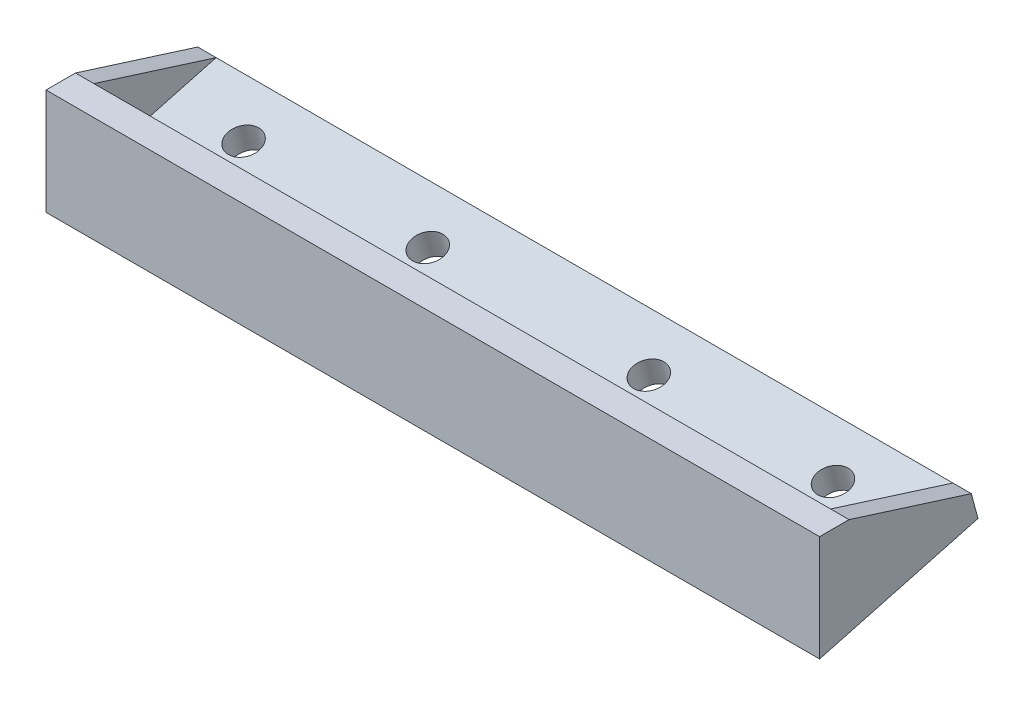
ISO-10303-21;
HEADER;
FILE_DESCRIPTION(('STEP AP214'),'2;1');
FILE_NAME('part.step','',(''),(''),'','','');
FILE_SCHEMA(('AUTOMOTIVE_DESIGN { 1 0 10303 214 1 1 1 1 }'));
ENDSEC;
DATA;
#1=APPLICATION_CONTEXT('core data for automotive mechanical design processes');
#2=APPLICATION_PROTOCOL_DEFINITION('international standard','automotive_design',2000,#1);
#3=PRODUCT_CONTEXT('',#1,'mechanical');
#4=PRODUCT('Part','Part','',(#3));
#5=PRODUCT_RELATED_PRODUCT_CATEGORY('part','',(#4));
#6=PRODUCT_DEFINITION_FORMATION('','',#4);
#7=PRODUCT_DEFINITION_CONTEXT('part definition',#1,'design');
#8=PRODUCT_DEFINITION('design','',#6,#7);
#9=PRODUCT_DEFINITION_SHAPE('','',#8);
#10=(LENGTH_UNIT() NAMED_UNIT(*) SI_UNIT(.MILLI.,.METRE.));
#11=(NAMED_UNIT(*) PLANE_ANGLE_UNIT() SI_UNIT($,.RADIAN.));
#12=(NAMED_UNIT(*) SI_UNIT($,.STERADIAN.) SOLID_ANGLE_UNIT());
#13=UNCERTAINTY_MEASURE_WITH_UNIT(LENGTH_MEASURE(1.E-05),#10,'distance_accuracy_value','');
#14=(GEOMETRIC_REPRESENTATION_CONTEXT(3) GLOBAL_UNCERTAINTY_ASSIGNED_CONTEXT((#13)) GLOBAL_UNIT_ASSIGNED_CONTEXT((#10,
#11,#12)) REPRESENTATION_CONTEXT('',''));
#15=CARTESIAN_POINT('',(0.,0.,0.));
#16=DIRECTION('',(0.,0.,1.));
#17=DIRECTION('',(1.,0.,0.));
#18=AXIS2_PLACEMENT_3D('',#15,#16,#17);
#19=CARTESIAN_POINT('',(158.,10.6217782649107,-60.));
#20=DIRECTION('',(0.,0.,1.));
#21=DIRECTION('',(1.,0.,0.));
#22=AXIS2_PLACEMENT_3D('',#19,#20,#21);
#23=PLANE('',#22);
#24=DIRECTION('',(0.,-1.,0.));
#25=VECTOR('',#24,1.);
#26=CARTESIAN_POINT('',(153.,30.,-60.));
#27=LINE('',#26,#25);
#28=CARTESIAN_POINT('',(153.,30.,-60.));
#29=VERTEX_POINT('',#28);
#30=CARTESIAN_POINT('',(153.,17.1379051291167,-60.));
#31=VERTEX_POINT('',#30);
#32=EDGE_CURVE('E68',#29,#31,#27,.T.);
#33=ORIENTED_EDGE('',*,*,#32,.T.);
#34=DIRECTION('',(-1.,0.,0.));
#35=VECTOR('',#34,1.);
#36=CARTESIAN_POINT('',(-52.,17.1379051291167,-60.));
#37=LINE('',#36,#35);
#38=CARTESIAN_POINT('',(-47.,17.1379051291167,-60.));
#39=VERTEX_POINT('',#38);
#40=EDGE_CURVE('E53',#31,#39,#37,.T.);
#41=ORIENTED_EDGE('',*,*,#40,.T.);
#42=DIRECTION('',(0.,1.,0.));
#43=VECTOR('',#42,1.);
#44=CARTESIAN_POINT('',(-47.,30.,-60.));
#45=LINE('',#44,#43);
#46=CARTESIAN_POINT('',(-47.,30.,-60.));
#47=VERTEX_POINT('',#46);
#48=EDGE_CURVE('E193',#39,#47,#45,.T.);
#49=ORIENTED_EDGE('',*,*,#48,.T.);
#50=DIRECTION('',(-1.,0.,0.));
#51=VECTOR('',#50,1.);
#52=CARTESIAN_POINT('',(158.,30.,-60.));
#53=LINE('',#52,#51);
#54=EDGE_CURVE('E230',#29,#47,#53,.T.);
#55=ORIENTED_EDGE('',*,*,#54,.F.);
#56=EDGE_LOOP('',(#33,#41,#49,#55));
#57=FACE_BOUND('',#56,.T.);
#58=ADVANCED_FACE('F43',(#57),#23,.F.);
#59=CARTESIAN_POINT('',(158.,20.,-95.));
#60=DIRECTION('',(0.,-0.965925826289068,-0.258819045102521));
#61=DIRECTION('',(0.,0.258819045102521,-0.965925826289068));
#62=AXIS2_PLACEMENT_3D('',#59,#60,#61);
#63=PLANE('',#62);
#64=CARTESIAN_POINT('',(-27.,16.1498999348201,-80.6312309425245));
#65=DIRECTION('',(0.,0.965925826289068,0.258819045102521));
#66=DIRECTION('',(0.,-0.258819045102521,0.965925826289068));
#67=AXIS2_PLACEMENT_3D('',#64,#65,#66);
#68=CIRCLE('',#67,4.25000000000001);
#69=CARTESIAN_POINT('',(-27.,15.0499189931344,-76.5260461807959));
#70=VERTEX_POINT('',#69);
#71=EDGE_CURVE('E162',#70,#70,#68,.T.);
#72=ORIENTED_EDGE('',*,*,#71,.F.);
#73=EDGE_LOOP('',(#72));
#74=FACE_BOUND('',#73,.T.);
#75=CARTESIAN_POINT('',(23.,16.1498999348201,-80.6312309425245));
#76=DIRECTION('',(0.,0.965925826289068,0.258819045102521));
#77=DIRECTION('',(0.,-0.258819045102521,0.965925826289068));
#78=AXIS2_PLACEMENT_3D('',#75,#76,#77);
#79=CIRCLE('',#78,4.25000000000001);
#80=CARTESIAN_POINT('',(23.,15.0499189931344,-76.5260461807959));
#81=VERTEX_POINT('',#80);
#82=EDGE_CURVE('E263',#81,#81,#79,.T.);
#83=ORIENTED_EDGE('',*,*,#82,.F.);
#84=EDGE_LOOP('',(#83));
#85=FACE_BOUND('',#84,.T.);
#86=CARTESIAN_POINT('',(83.,16.1498999348201,-80.6312309425245));
#87=DIRECTION('',(0.,0.965925826289068,0.258819045102521));
#88=DIRECTION('',(0.,-0.258819045102521,0.965925826289068));
#89=AXIS2_PLACEMENT_3D('',#86,#87,#88);
#90=CIRCLE('',#89,4.25000000000001);
#91=CARTESIAN_POINT('',(83.,15.0499189931344,-76.5260461807959));
#92=VERTEX_POINT('',#91);
#93=EDGE_CURVE('E259',#92,#92,#90,.T.);
#94=ORIENTED_EDGE('',*,*,#93,.F.);
#95=EDGE_LOOP('',(#94));
#96=FACE_BOUND('',#95,.T.);
#97=CARTESIAN_POINT('',(133.,16.1498999348201,-80.6312309425245));
#98=DIRECTION('',(0.,0.965925826289068,0.258819045102521));
#99=DIRECTION('',(0.,-0.258819045102521,0.965925826289068));
#100=AXIS2_PLACEMENT_3D('',#97,#98,#99);
#101=CIRCLE('',#100,4.25000000000001);
#102=CARTESIAN_POINT('',(133.,15.0499189931344,-76.5260461807959));
#103=VERTEX_POINT('',#102);
#104=EDGE_CURVE('E139',#103,#103,#101,.T.);
#105=ORIENTED_EDGE('',*,*,#104,.F.);
#106=EDGE_LOOP('',(#105));
#107=FACE_BOUND('',#106,.T.);
#108=DIRECTION('',(0.,0.258819045102521,-0.965925826289068));
#109=VECTOR('',#108,1.);
#110=CARTESIAN_POINT('',(153.,12.3082759976714,-66.2940952255126));
#111=LINE('',#110,#109);
#112=CARTESIAN_POINT('',(153.,12.3082759976714,-66.2940952255126));
#113=VERTEX_POINT('',#112);
#114=CARTESIAN_POINT('',(153.,19.5145475211529,-93.1882666842824));
#115=VERTEX_POINT('',#114);
#116=EDGE_CURVE('E180',#113,#115,#111,.T.);
#117=ORIENTED_EDGE('',*,*,#116,.T.);
#118=DIRECTION('',(-1.,0.,0.));
#119=VECTOR('',#118,1.);
#120=CARTESIAN_POINT('',(158.,19.5145475211529,-93.1882666842824));
#121=LINE('',#120,#119);
#122=CARTESIAN_POINT('',(-47.,19.5145475211529,-93.1882666842824));
#123=VERTEX_POINT('',#122);
#124=EDGE_CURVE('E213',#115,#123,#121,.T.);
#125=ORIENTED_EDGE('',*,*,#124,.T.);
#126=DIRECTION('',(0.,-0.258819045102521,0.965925826289068));
#127=VECTOR('',#126,1.);
#128=CARTESIAN_POINT('',(-47.,12.3082759976714,-66.2940952255126));
#129=LINE('',#128,#127);
#130=CARTESIAN_POINT('',(-47.,12.3082759976714,-66.2940952255126));
#131=VERTEX_POINT('',#130);
#132=EDGE_CURVE('E185',#123,#131,#129,.T.);
#133=ORIENTED_EDGE('',*,*,#132,.T.);
#134=DIRECTION('',(-1.,0.,0.));
#135=VECTOR('',#134,1.);
#136=CARTESIAN_POINT('',(158.,12.3082759976714,-66.2940952255126));
#137=LINE('',#136,#135);
#138=EDGE_CURVE('E11',#131,#113,#137,.F.);
#139=ORIENTED_EDGE('',*,*,#138,.T.);
#140=EDGE_LOOP('',(#117,#125,#133,#139));
#141=FACE_BOUND('',#140,.T.);
#142=ADVANCED_FACE('F245',(#74,#85,#96,#107,#141),#63,.F.);
#143=CARTESIAN_POINT('',(158.,17.1379051291167,-65.));
#144=DIRECTION('',(1.,0.,0.));
#145=DIRECTION('',(0.,0.,-1.));
#146=AXIS2_PLACEMENT_3D('',#143,#144,#145);
#147=CYLINDRICAL_SURFACE('',#146,5.);
#148=CARTESIAN_POINT('',(153.,17.1379051291167,-65.));
#149=DIRECTION('',(1.,0.,0.));
#150=DIRECTION('',(0.,0.,-1.));
#151=AXIS2_PLACEMENT_3D('',#148,#149,#150);
#152=CIRCLE('',#151,5.);
#153=EDGE_CURVE('E61',#31,#113,#152,.T.);
#154=ORIENTED_EDGE('',*,*,#153,.T.);
#155=ORIENTED_EDGE('',*,*,#138,.F.);
#156=CARTESIAN_POINT('',(-47.,17.1379051291167,-65.));
#157=DIRECTION('',(-1.,0.,0.));
#158=DIRECTION('',(0.,0.,1.));
#159=AXIS2_PLACEMENT_3D('',#156,#157,#158);
#160=CIRCLE('',#159,5.);
#161=EDGE_CURVE('E188',#131,#39,#160,.T.);
#162=ORIENTED_EDGE('',*,*,#161,.T.);
#163=ORIENTED_EDGE('',*,*,#40,.F.);
#164=EDGE_LOOP('',(#154,#155,#162,#163));
#165=FACE_BOUND('',#164,.T.);
#166=ADVANCED_FACE('F45',(#165),#147,.F.);
#167=CARTESIAN_POINT('',(160.,30.,-31.93));
#168=DIRECTION('',(0.,1.,0.));
#169=DIRECTION('',(0.,0.,1.));
#170=AXIS2_PLACEMENT_3D('',#167,#168,#169);
#171=PLANE('',#170);
#172=DIRECTION('',(-1.,0.,0.));
#173=VECTOR('',#172,1.);
#174=CARTESIAN_POINT('',(160.,30.,-52.));
#175=LINE('',#174,#173);
#176=CARTESIAN_POINT('',(158.,30.,-52.));
#177=VERTEX_POINT('',#176);
#178=CARTESIAN_POINT('',(-52.,30.,-52.));
#179=VERTEX_POINT('',#178);
#180=EDGE_CURVE('E120',#177,#179,#175,.T.);
#181=ORIENTED_EDGE('',*,*,#180,.F.);
#182=DIRECTION('',(0.,0.,1.));
#183=VECTOR('',#182,1.);
#184=CARTESIAN_POINT('',(158.,30.,0.));
#185=LINE('',#184,#183);
#186=CARTESIAN_POINT('',(158.,30.,-60.));
#187=VERTEX_POINT('',#186);
#188=EDGE_CURVE('E135',#187,#177,#185,.T.);
#189=ORIENTED_EDGE('',*,*,#188,.F.);
#190=EDGE_CURVE('E153',#187,#29,#53,.T.);
#191=ORIENTED_EDGE('',*,*,#190,.T.);
#192=ORIENTED_EDGE('',*,*,#54,.T.);
#193=DIRECTION('',(-1.,0.,0.));
#194=VECTOR('',#193,1.);
#195=CARTESIAN_POINT('',(-47.,30.,-60.));
#196=LINE('',#195,#194);
#197=CARTESIAN_POINT('',(-52.,30.,-60.));
#198=VERTEX_POINT('',#197);
#199=EDGE_CURVE('E200',#47,#198,#196,.T.);
#200=ORIENTED_EDGE('',*,*,#199,.T.);
#201=DIRECTION('',(0.,0.,1.));
#202=VECTOR('',#201,1.);
#203=CARTESIAN_POINT('',(-52.,30.,0.));
#204=LINE('',#203,#202);
#205=EDGE_CURVE('E138',#198,#179,#204,.T.);
#206=ORIENTED_EDGE('',*,*,#205,.T.);
#207=EDGE_LOOP('',(#181,#189,#191,#192,#200,#206));
#208=FACE_BOUND('',#207,.T.);
#209=ADVANCED_FACE('F133',(#208),#171,.T.);
#210=CARTESIAN_POINT('',(158.,0.,0.));
#211=DIRECTION('',(-1.,0.,0.));
#212=DIRECTION('',(0.,0.,1.));
#213=AXIS2_PLACEMENT_3D('',#210,#211,#212);
#214=PLANE('',#213);
#215=ORIENTED_EDGE('',*,*,#188,.T.);
#216=DIRECTION('',(0.,-1.,0.));
#217=VECTOR('',#216,1.);
#218=CARTESIAN_POINT('',(158.,17.3,-52.));
#219=LINE('',#218,#217);
#220=CARTESIAN_POINT('',(158.,1.2312514625911,-52.));
#221=VERTEX_POINT('',#220);
#222=EDGE_CURVE('E117',#177,#221,#219,.T.);
#223=ORIENTED_EDGE('',*,*,#222,.T.);
#224=DIRECTION('',(0.,0.258819045102521,-0.965925826289068));
#225=VECTOR('',#224,1.);
#226=CARTESIAN_POINT('',(158.,12.7530667371294,-95.));
#227=LINE('',#226,#225);
#228=CARTESIAN_POINT('',(158.,12.7530667371294,-95.));
#229=VERTEX_POINT('',#228);
#230=EDGE_CURVE('E222',#221,#229,#227,.T.);
#231=ORIENTED_EDGE('',*,*,#230,.T.);
#232=DIRECTION('',(0.,0.965925826289068,0.25881904510252));
#233=VECTOR('',#232,1.);
#234=CARTESIAN_POINT('',(158.,12.7530667371294,-95.));
#235=LINE('',#234,#233);
#236=CARTESIAN_POINT('',(158.,19.5145475211529,-93.1882666842824));
#237=VERTEX_POINT('',#236);
#238=EDGE_CURVE('E211',#229,#237,#235,.T.);
#239=ORIENTED_EDGE('',*,*,#238,.T.);
#240=DIRECTION('',(0.,0.301260615671901,0.95354184042704));
#241=VECTOR('',#240,1.);
#242=CARTESIAN_POINT('',(158.,19.5145475211529,-93.1882666842824));
#243=LINE('',#242,#241);
#244=EDGE_CURVE('E145',#237,#187,#243,.T.);
#245=ORIENTED_EDGE('',*,*,#244,.T.);
#246=EDGE_LOOP('',(#215,#223,#231,#239,#245));
#247=FACE_BOUND('',#246,.T.);
#248=ADVANCED_FACE('F142',(#247),#214,.F.);
#249=CARTESIAN_POINT('',(-52.,0.,0.));
#250=DIRECTION('',(-1.,0.,0.));
#251=DIRECTION('',(0.,0.,1.));
#252=AXIS2_PLACEMENT_3D('',#249,#250,#251);
#253=PLANE('',#252);
#254=DIRECTION('',(0.,-1.,0.));
#255=VECTOR('',#254,1.);
#256=CARTESIAN_POINT('',(-52.,17.3,-52.));
#257=LINE('',#256,#255);
#258=CARTESIAN_POINT('',(-52.,1.2312514625911,-52.));
#259=VERTEX_POINT('',#258);
#260=EDGE_CURVE('E130',#179,#259,#257,.T.);
#261=ORIENTED_EDGE('',*,*,#260,.F.);
#262=ORIENTED_EDGE('',*,*,#205,.F.);
#263=DIRECTION('',(0.,-0.301260615671901,-0.95354184042704));
#264=VECTOR('',#263,1.);
#265=CARTESIAN_POINT('',(-52.,19.5145475211529,-93.1882666842824));
#266=LINE('',#265,#264);
#267=CARTESIAN_POINT('',(-52.,19.5145475211529,-93.1882666842824));
#268=VERTEX_POINT('',#267);
#269=EDGE_CURVE('E189',#198,#268,#266,.T.);
#270=ORIENTED_EDGE('',*,*,#269,.T.);
#271=DIRECTION('',(0.,0.965925826289068,0.25881904510252));
#272=VECTOR('',#271,1.);
#273=CARTESIAN_POINT('',(-52.,12.7530667371294,-95.));
#274=LINE('',#273,#272);
#275=CARTESIAN_POINT('',(-52.,12.7530667371294,-95.));
#276=VERTEX_POINT('',#275);
#277=EDGE_CURVE('E208',#276,#268,#274,.T.);
#278=ORIENTED_EDGE('',*,*,#277,.F.);
#279=DIRECTION('',(0.,0.258819045102521,-0.965925826289068));
#280=VECTOR('',#279,1.);
#281=CARTESIAN_POINT('',(-52.,12.7530667371294,-95.));
#282=LINE('',#281,#280);
#283=EDGE_CURVE('E129',#259,#276,#282,.T.);
#284=ORIENTED_EDGE('',*,*,#283,.F.);
#285=EDGE_LOOP('',(#261,#262,#270,#278,#284));
#286=FACE_BOUND('',#285,.T.);
#287=ADVANCED_FACE('F293',(#286),#253,.T.);
#288=CARTESIAN_POINT('',(158.,12.7530667371294,-95.));
#289=DIRECTION('',(0.,0.965925826289068,0.258819045102521));
#290=DIRECTION('',(0.,-0.258819045102521,0.965925826289068));
#291=AXIS2_PLACEMENT_3D('',#288,#289,#290);
#292=PLANE('',#291);
#293=CARTESIAN_POINT('',(-27.,9.38841915079663,-82.4429642582421));
#294=DIRECTION('',(0.,0.965925826289068,0.258819045102521));
#295=DIRECTION('',(0.,-0.258819045102521,0.965925826289068));
#296=AXIS2_PLACEMENT_3D('',#293,#294,#295);
#297=CIRCLE('',#296,4.25000000000001);
#298=CARTESIAN_POINT('',(-27.,8.28843820911091,-78.3377794965136));
#299=VERTEX_POINT('',#298);
#300=EDGE_CURVE('E47',#299,#299,#297,.T.);
#301=ORIENTED_EDGE('',*,*,#300,.T.);
#302=EDGE_LOOP('',(#301));
#303=FACE_BOUND('',#302,.T.);
#304=CARTESIAN_POINT('',(23.,9.38841915079663,-82.4429642582421));
#305=DIRECTION('',(0.,0.965925826289068,0.258819045102521));
#306=DIRECTION('',(0.,-0.258819045102521,0.965925826289068));
#307=AXIS2_PLACEMENT_3D('',#304,#305,#306);
#308=CIRCLE('',#307,4.25000000000001);
#309=CARTESIAN_POINT('',(23.,8.28843820911091,-78.3377794965136));
#310=VERTEX_POINT('',#309);
#311=EDGE_CURVE('E165',#310,#310,#308,.T.);
#312=ORIENTED_EDGE('',*,*,#311,.T.);
#313=EDGE_LOOP('',(#312));
#314=FACE_BOUND('',#313,.T.);
#315=CARTESIAN_POINT('',(83.,9.38841915079663,-82.4429642582421));
#316=DIRECTION('',(0.,0.965925826289068,0.258819045102521));
#317=DIRECTION('',(0.,-0.258819045102521,0.965925826289068));
#318=AXIS2_PLACEMENT_3D('',#315,#316,#317);
#319=CIRCLE('',#318,4.25000000000001);
#320=CARTESIAN_POINT('',(83.,8.28843820911091,-78.3377794965136));
#321=VERTEX_POINT('',#320);
#322=EDGE_CURVE('E161',#321,#321,#319,.T.);
#323=ORIENTED_EDGE('',*,*,#322,.T.);
#324=EDGE_LOOP('',(#323));
#325=FACE_BOUND('',#324,.T.);
#326=CARTESIAN_POINT('',(133.,9.38841915079663,-82.4429642582421));
#327=DIRECTION('',(0.,0.965925826289068,0.258819045102521));
#328=DIRECTION('',(0.,-0.258819045102521,0.965925826289068));
#329=AXIS2_PLACEMENT_3D('',#326,#327,#328);
#330=CIRCLE('',#329,4.25000000000001);
#331=CARTESIAN_POINT('',(133.,8.28843820911091,-78.3377794965136));
#332=VERTEX_POINT('',#331);
#333=EDGE_CURVE('E157',#332,#332,#330,.T.);
#334=ORIENTED_EDGE('',*,*,#333,.T.);
#335=EDGE_LOOP('',(#334));
#336=FACE_BOUND('',#335,.T.);
#337=ORIENTED_EDGE('',*,*,#283,.T.);
#338=DIRECTION('',(-1.,0.,0.));
#339=VECTOR('',#338,1.);
#340=CARTESIAN_POINT('',(158.,12.7530667371294,-95.));
#341=LINE('',#340,#339);
#342=EDGE_CURVE('E228',#229,#276,#341,.T.);
#343=ORIENTED_EDGE('',*,*,#342,.F.);
#344=ORIENTED_EDGE('',*,*,#230,.F.);
#345=DIRECTION('',(-1.,0.,0.));
#346=VECTOR('',#345,1.);
#347=CARTESIAN_POINT('',(158.,1.2312514625911,-52.));
#348=LINE('',#347,#346);
#349=EDGE_CURVE('E123',#221,#259,#348,.T.);
#350=ORIENTED_EDGE('',*,*,#349,.T.);
#351=EDGE_LOOP('',(#337,#343,#344,#350));
#352=FACE_BOUND('',#351,.T.);
#353=ADVANCED_FACE('F290',(#303,#314,#325,#336,#352),#292,.F.);
#354=CARTESIAN_POINT('',(158.,17.3,-52.));
#355=DIRECTION('',(0.,0.,-1.));
#356=DIRECTION('',(-1.,0.,0.));
#357=AXIS2_PLACEMENT_3D('',#354,#355,#356);
#358=PLANE('',#357);
#359=ORIENTED_EDGE('',*,*,#222,.F.);
#360=ORIENTED_EDGE('',*,*,#180,.T.);
#361=ORIENTED_EDGE('',*,*,#260,.T.);
#362=ORIENTED_EDGE('',*,*,#349,.F.);
#363=EDGE_LOOP('',(#359,#360,#361,#362));
#364=FACE_BOUND('',#363,.T.);
#365=ADVANCED_FACE('F119',(#364),#358,.F.);
#366=CARTESIAN_POINT('',(158.,12.7530667371294,-95.));
#367=DIRECTION('',(0.,-0.25881904510252,0.965925826289068));
#368=DIRECTION('',(0.,-0.965925826289068,-0.25881904510252));
#369=AXIS2_PLACEMENT_3D('',#366,#367,#368);
#370=PLANE('',#369);
#371=ORIENTED_EDGE('',*,*,#277,.T.);
#372=DIRECTION('',(-1.,0.,0.));
#373=VECTOR('',#372,1.);
#374=CARTESIAN_POINT('',(-47.,19.5145475211529,-93.1882666842824));
#375=LINE('',#374,#373);
#376=EDGE_CURVE('E204',#123,#268,#375,.T.);
#377=ORIENTED_EDGE('',*,*,#376,.F.);
#378=ORIENTED_EDGE('',*,*,#124,.F.);
#379=EDGE_CURVE('E216',#237,#115,#121,.T.);
#380=ORIENTED_EDGE('',*,*,#379,.F.);
#381=ORIENTED_EDGE('',*,*,#238,.F.);
#382=ORIENTED_EDGE('',*,*,#342,.T.);
#383=EDGE_LOOP('',(#371,#377,#378,#380,#381,#382));
#384=FACE_BOUND('',#383,.T.);
#385=ADVANCED_FACE('F300',(#384),#370,.F.);
#386=CARTESIAN_POINT('',(-47.,19.5145475211529,-93.1882666842824));
#387=DIRECTION('',(0.,0.95354184042704,-0.301260615671901));
#388=DIRECTION('',(0.,0.301260615671901,0.95354184042704));
#389=AXIS2_PLACEMENT_3D('',#386,#387,#388);
#390=PLANE('',#389);
#391=ORIENTED_EDGE('',*,*,#269,.F.);
#392=ORIENTED_EDGE('',*,*,#199,.F.);
#393=DIRECTION('',(0.,-0.301260615671901,-0.95354184042704));
#394=VECTOR('',#393,1.);
#395=CARTESIAN_POINT('',(-47.,19.5145475211529,-93.1882666842824));
#396=LINE('',#395,#394);
#397=EDGE_CURVE('E196',#47,#123,#396,.T.);
#398=ORIENTED_EDGE('',*,*,#397,.T.);
#399=ORIENTED_EDGE('',*,*,#376,.T.);
#400=EDGE_LOOP('',(#391,#392,#398,#399));
#401=FACE_BOUND('',#400,.T.);
#402=ADVANCED_FACE('F240',(#401),#390,.T.);
#403=CARTESIAN_POINT('',(-47.,17.1379051291167,-65.));
#404=DIRECTION('',(-1.,0.,0.));
#405=DIRECTION('',(0.,0.,1.));
#406=AXIS2_PLACEMENT_3D('',#403,#404,#405);
#407=PLANE('',#406);
#408=ORIENTED_EDGE('',*,*,#132,.F.);
#409=ORIENTED_EDGE('',*,*,#397,.F.);
#410=ORIENTED_EDGE('',*,*,#48,.F.);
#411=ORIENTED_EDGE('',*,*,#161,.F.);
#412=EDGE_LOOP('',(#408,#409,#410,#411));
#413=FACE_BOUND('',#412,.T.);
#414=ADVANCED_FACE('F242',(#413),#407,.F.);
#415=CARTESIAN_POINT('',(153.,19.5145475211529,-93.1882666842824));
#416=DIRECTION('',(0.,0.95354184042704,-0.301260615671901));
#417=DIRECTION('',(0.,0.301260615671901,0.95354184042704));
#418=AXIS2_PLACEMENT_3D('',#415,#416,#417);
#419=PLANE('',#418);
#420=ORIENTED_EDGE('',*,*,#244,.F.);
#421=ORIENTED_EDGE('',*,*,#379,.T.);
#422=DIRECTION('',(0.,0.301260615671901,0.95354184042704));
#423=VECTOR('',#422,1.);
#424=CARTESIAN_POINT('',(153.,19.5145475211529,-93.1882666842824));
#425=LINE('',#424,#423);
#426=EDGE_CURVE('E251',#115,#29,#425,.T.);
#427=ORIENTED_EDGE('',*,*,#426,.T.);
#428=ORIENTED_EDGE('',*,*,#190,.F.);
#429=EDGE_LOOP('',(#420,#421,#427,#428));
#430=FACE_BOUND('',#429,.T.);
#431=ADVANCED_FACE('F302',(#430),#419,.T.);
#432=CARTESIAN_POINT('',(153.,17.1379051291167,-65.));
#433=DIRECTION('',(1.,0.,0.));
#434=DIRECTION('',(0.,0.,-1.));
#435=AXIS2_PLACEMENT_3D('',#432,#433,#434);
#436=PLANE('',#435);
#437=ORIENTED_EDGE('',*,*,#153,.F.);
#438=ORIENTED_EDGE('',*,*,#32,.F.);
#439=ORIENTED_EDGE('',*,*,#426,.F.);
#440=ORIENTED_EDGE('',*,*,#116,.F.);
#441=EDGE_LOOP('',(#437,#438,#439,#440));
#442=FACE_BOUND('',#441,.T.);
#443=ADVANCED_FACE('F249',(#442),#436,.F.);
#444=CARTESIAN_POINT('',(133.,-2.51035410302427,-85.6312309425245));
#445=DIRECTION('',(0.,0.965925826289068,0.258819045102521));
#446=DIRECTION('',(0.,-0.258819045102521,0.965925826289068));
#447=AXIS2_PLACEMENT_3D('',#444,#445,#446);
#448=CYLINDRICAL_SURFACE('',#447,4.25000000000001);
#449=ORIENTED_EDGE('',*,*,#104,.T.);
#450=EDGE_LOOP('',(#449));
#451=FACE_BOUND('',#450,.T.);
#452=ORIENTED_EDGE('',*,*,#333,.F.);
#453=EDGE_LOOP('',(#452));
#454=FACE_BOUND('',#453,.T.);
#455=ADVANCED_FACE('F283',(#451,#454),#448,.F.);
#456=CARTESIAN_POINT('',(83.,-2.51035410302427,-85.6312309425245));
#457=DIRECTION('',(0.,0.965925826289068,0.258819045102521));
#458=DIRECTION('',(0.,-0.258819045102521,0.965925826289068));
#459=AXIS2_PLACEMENT_3D('',#456,#457,#458);
#460=CYLINDRICAL_SURFACE('',#459,4.25000000000001);
#461=ORIENTED_EDGE('',*,*,#93,.T.);
#462=EDGE_LOOP('',(#461));
#463=FACE_BOUND('',#462,.T.);
#464=ORIENTED_EDGE('',*,*,#322,.F.);
#465=EDGE_LOOP('',(#464));
#466=FACE_BOUND('',#465,.T.);
#467=ADVANCED_FACE('F286',(#463,#466),#460,.F.);
#468=CARTESIAN_POINT('',(23.,-2.51035410302427,-85.6312309425245));
#469=DIRECTION('',(0.,0.965925826289068,0.258819045102521));
#470=DIRECTION('',(0.,-0.258819045102521,0.965925826289068));
#471=AXIS2_PLACEMENT_3D('',#468,#469,#470);
#472=CYLINDRICAL_SURFACE('',#471,4.25000000000001);
#473=ORIENTED_EDGE('',*,*,#82,.T.);
#474=EDGE_LOOP('',(#473));
#475=FACE_BOUND('',#474,.T.);
#476=ORIENTED_EDGE('',*,*,#311,.F.);
#477=EDGE_LOOP('',(#476));
#478=FACE_BOUND('',#477,.T.);
#479=ADVANCED_FACE('F381',(#475,#478),#472,.F.);
#480=CARTESIAN_POINT('',(-27.,-2.51035410302427,-85.6312309425245));
#481=DIRECTION('',(0.,0.965925826289068,0.258819045102521));
#482=DIRECTION('',(0.,-0.258819045102521,0.965925826289068));
#483=AXIS2_PLACEMENT_3D('',#480,#481,#482);
#484=CYLINDRICAL_SURFACE('',#483,4.25000000000001);
#485=ORIENTED_EDGE('',*,*,#71,.T.);
#486=EDGE_LOOP('',(#485));
#487=FACE_BOUND('',#486,.T.);
#488=ORIENTED_EDGE('',*,*,#300,.F.);
#489=EDGE_LOOP('',(#488));
#490=FACE_BOUND('',#489,.T.);
#491=ADVANCED_FACE('F271',(#487,#490),#484,.F.);
#492=CLOSED_SHELL('',(#58,#142,#166,#209,#248,#287,#353,#365,#385,#402,#414,#431,#443,#455,#467,
#479,#491));
#493=MANIFOLD_SOLID_BREP('B2',#492);
#494=ADVANCED_BREP_SHAPE_REPRESENTATION('',(#18,#493),#14);
#495=SHAPE_DEFINITION_REPRESENTATION(#9,#494);
ENDSEC;
END-ISO-10303-21;
